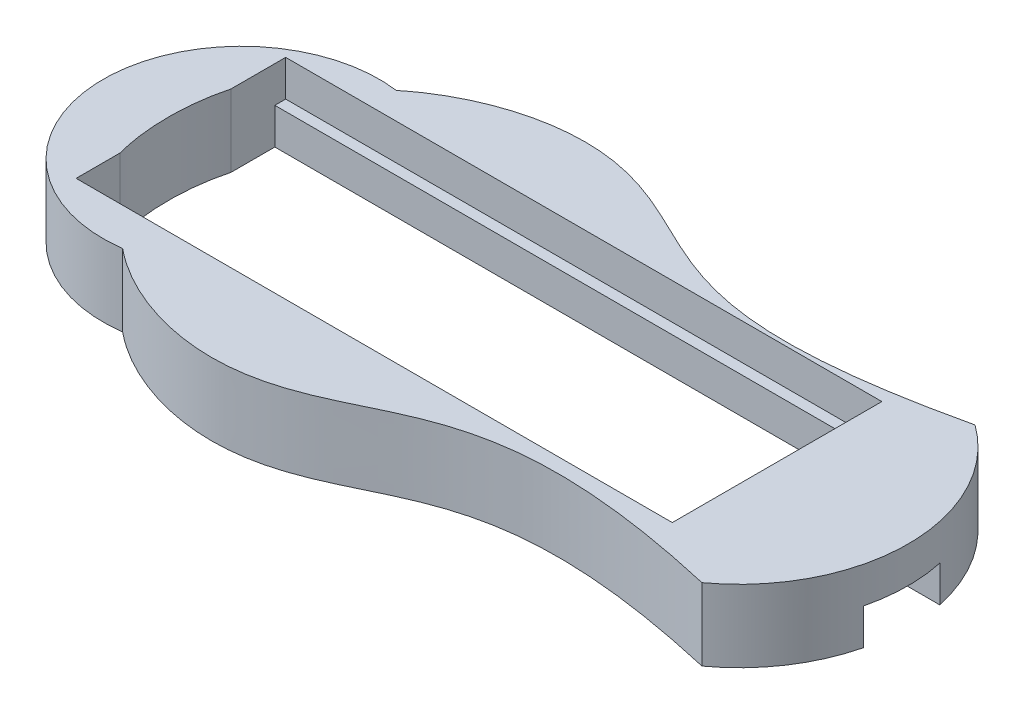
ISO-10303-21;
HEADER;
FILE_DESCRIPTION(('STEP AP214'),'2;1');
FILE_NAME('part.step','',(''),(''),'','','');
FILE_SCHEMA(('AUTOMOTIVE_DESIGN { 1 0 10303 214 1 1 1 1 }'));
ENDSEC;
DATA;
#1=APPLICATION_CONTEXT('core data for automotive mechanical design processes');
#2=APPLICATION_PROTOCOL_DEFINITION('international standard','automotive_design',2000,#1);
#3=PRODUCT_CONTEXT('',#1,'mechanical');
#4=PRODUCT('Part','Part','',(#3));
#5=PRODUCT_RELATED_PRODUCT_CATEGORY('part','',(#4));
#6=PRODUCT_DEFINITION_FORMATION('','',#4);
#7=PRODUCT_DEFINITION_CONTEXT('part definition',#1,'design');
#8=PRODUCT_DEFINITION('design','',#6,#7);
#9=PRODUCT_DEFINITION_SHAPE('','',#8);
#10=(LENGTH_UNIT() NAMED_UNIT(*) SI_UNIT(.MILLI.,.METRE.));
#11=(NAMED_UNIT(*) PLANE_ANGLE_UNIT() SI_UNIT($,.RADIAN.));
#12=(NAMED_UNIT(*) SI_UNIT($,.STERADIAN.) SOLID_ANGLE_UNIT());
#13=UNCERTAINTY_MEASURE_WITH_UNIT(LENGTH_MEASURE(1.E-05),#10,'distance_accuracy_value','');
#14=(GEOMETRIC_REPRESENTATION_CONTEXT(3) GLOBAL_UNCERTAINTY_ASSIGNED_CONTEXT((#13)) GLOBAL_UNIT_ASSIGNED_CONTEXT((#10,
#11,#12)) REPRESENTATION_CONTEXT('',''));
#15=CARTESIAN_POINT('',(0.,0.,0.));
#16=DIRECTION('',(0.,0.,1.));
#17=DIRECTION('',(1.,0.,0.));
#18=AXIS2_PLACEMENT_3D('',#15,#16,#17);
#19=CARTESIAN_POINT('',(-38.2102703595457,20.,0.));
#20=DIRECTION('',(-1.,0.,0.));
#21=DIRECTION('',(0.,0.,1.));
#22=AXIS2_PLACEMENT_3D('',#19,#20,#21);
#23=PLANE('',#22);
#24=DIRECTION('',(0.,0.,-1.));
#25=VECTOR('',#24,1.);
#26=CARTESIAN_POINT('',(-38.2102703595457,0.,0.));
#27=LINE('',#26,#25);
#28=CARTESIAN_POINT('',(-38.2102703595457,0.,-38.3901446940217));
#29=VERTEX_POINT('',#28);
#30=CARTESIAN_POINT('',(-38.2102703595457,0.,-50.5398767109405));
#31=VERTEX_POINT('',#30);
#32=EDGE_CURVE('E250',#29,#31,#27,.T.);
#33=ORIENTED_EDGE('',*,*,#32,.T.);
#34=DIRECTION('',(0.,-1.,0.));
#35=VECTOR('',#34,1.);
#36=CARTESIAN_POINT('',(-38.2102703595457,20.,-50.5398767109405));
#37=LINE('',#36,#35);
#38=CARTESIAN_POINT('',(-38.2102703595457,10.,-50.5398767109405));
#39=VERTEX_POINT('',#38);
#40=EDGE_CURVE('E260',#39,#31,#37,.T.);
#41=ORIENTED_EDGE('',*,*,#40,.F.);
#42=DIRECTION('',(0.,0.,1.));
#43=VECTOR('',#42,1.);
#44=CARTESIAN_POINT('',(-38.2102703595457,10.,-50.5398767109405));
#45=LINE('',#44,#43);
#46=CARTESIAN_POINT('',(-38.2102703595457,10.,-53.5398767109405));
#47=VERTEX_POINT('',#46);
#48=EDGE_CURVE('E216',#47,#39,#45,.T.);
#49=ORIENTED_EDGE('',*,*,#48,.F.);
#50=DIRECTION('',(0.,1.,0.));
#51=VECTOR('',#50,1.);
#52=CARTESIAN_POINT('',(-38.2102703595457,10.,-53.5398767109405));
#53=LINE('',#52,#51);
#54=CARTESIAN_POINT('',(-38.2102703595457,20.,-53.5398767109405));
#55=VERTEX_POINT('',#54);
#56=EDGE_CURVE('E213',#47,#55,#53,.T.);
#57=ORIENTED_EDGE('',*,*,#56,.T.);
#58=DIRECTION('',(0.,0.,-1.));
#59=VECTOR('',#58,1.);
#60=CARTESIAN_POINT('',(-38.2102703595457,20.,0.));
#61=LINE('',#60,#59);
#62=CARTESIAN_POINT('',(-38.2102703595457,20.,-38.3901446940217));
#63=VERTEX_POINT('',#62);
#64=EDGE_CURVE('E149',#63,#55,#61,.T.);
#65=ORIENTED_EDGE('',*,*,#64,.F.);
#66=DIRECTION('',(0.,-1.,0.));
#67=VECTOR('',#66,1.);
#68=CARTESIAN_POINT('',(-38.2102703595457,20.,-38.3901446940217));
#69=LINE('',#68,#67);
#70=EDGE_CURVE('E64',#63,#29,#69,.T.);
#71=ORIENTED_EDGE('',*,*,#70,.T.);
#72=EDGE_LOOP('',(#33,#41,#49,#57,#65,#71));
#73=FACE_BOUND('',#72,.T.);
#74=ADVANCED_FACE('F39',(#73),#23,.F.);
#75=CARTESIAN_POINT('',(0.,20.,-50.5398767109405));
#76=DIRECTION('',(0.,0.,-1.));
#77=DIRECTION('',(-1.,0.,0.));
#78=AXIS2_PLACEMENT_3D('',#75,#76,#77);
#79=PLANE('',#78);
#80=DIRECTION('',(0.,-1.,0.));
#81=VECTOR('',#80,1.);
#82=CARTESIAN_POINT('',(126.789729640454,20.,-50.5398767109405));
#83=LINE('',#82,#81);
#84=CARTESIAN_POINT('',(126.789729640454,10.,-50.5398767109405));
#85=VERTEX_POINT('',#84);
#86=CARTESIAN_POINT('',(126.789729640454,0.,-50.5398767109405));
#87=VERTEX_POINT('',#86);
#88=EDGE_CURVE('E257',#85,#87,#83,.T.);
#89=ORIENTED_EDGE('',*,*,#88,.F.);
#90=DIRECTION('',(1.,0.,0.));
#91=VECTOR('',#90,1.);
#92=CARTESIAN_POINT('',(-38.2102703595457,10.,-50.5398767109405));
#93=LINE('',#92,#91);
#94=EDGE_CURVE('E227',#39,#85,#93,.T.);
#95=ORIENTED_EDGE('',*,*,#94,.F.);
#96=ORIENTED_EDGE('',*,*,#40,.T.);
#97=DIRECTION('',(1.,0.,0.));
#98=VECTOR('',#97,1.);
#99=CARTESIAN_POINT('',(0.,0.,-50.5398767109405));
#100=LINE('',#99,#98);
#101=EDGE_CURVE('E301',#31,#87,#100,.T.);
#102=ORIENTED_EDGE('',*,*,#101,.T.);
#103=EDGE_LOOP('',(#89,#95,#96,#102));
#104=FACE_BOUND('',#103,.T.);
#105=ADVANCED_FACE('F182',(#104),#79,.F.);
#106=CARTESIAN_POINT('',(126.789729640454,20.,0.));
#107=DIRECTION('',(-1.,0.,0.));
#108=DIRECTION('',(0.,0.,1.));
#109=AXIS2_PLACEMENT_3D('',#106,#107,#108);
#110=PLANE('',#109);
#111=DIRECTION('',(0.,-1.,0.));
#112=VECTOR('',#111,1.);
#113=CARTESIAN_POINT('',(126.789729640454,10.,-11.9953206685679));
#114=LINE('',#113,#112);
#115=CARTESIAN_POINT('',(126.789729640454,10.,-11.9953206685679));
#116=VERTEX_POINT('',#115);
#117=CARTESIAN_POINT('',(126.789729640454,0.,-11.9953206685679));
#118=VERTEX_POINT('',#117);
#119=EDGE_CURVE('E333',#116,#118,#114,.T.);
#120=ORIENTED_EDGE('',*,*,#119,.T.);
#121=DIRECTION('',(0.,0.,-1.));
#122=VECTOR('',#121,1.);
#123=CARTESIAN_POINT('',(126.789729640454,0.,0.));
#124=LINE('',#123,#122);
#125=CARTESIAN_POINT('',(126.789729640454,0.,4.46012328905949));
#126=VERTEX_POINT('',#125);
#127=EDGE_CURVE('E279',#126,#118,#124,.T.);
#128=ORIENTED_EDGE('',*,*,#127,.F.);
#129=DIRECTION('',(0.,-1.,0.));
#130=VECTOR('',#129,1.);
#131=CARTESIAN_POINT('',(126.789729640454,20.,4.46012328905949));
#132=LINE('',#131,#130);
#133=CARTESIAN_POINT('',(126.789729640454,20.,4.46012328905949));
#134=VERTEX_POINT('',#133);
#135=EDGE_CURVE('E139',#134,#126,#132,.T.);
#136=ORIENTED_EDGE('',*,*,#135,.F.);
#137=DIRECTION('',(0.,0.,-1.));
#138=VECTOR('',#137,1.);
#139=CARTESIAN_POINT('',(126.789729640454,20.,0.));
#140=LINE('',#139,#138);
#141=CARTESIAN_POINT('',(126.789729640454,20.,-53.5398767109405));
#142=VERTEX_POINT('',#141);
#143=EDGE_CURVE('E156',#134,#142,#140,.T.);
#144=ORIENTED_EDGE('',*,*,#143,.T.);
#145=DIRECTION('',(0.,1.,0.));
#146=VECTOR('',#145,1.);
#147=CARTESIAN_POINT('',(126.789729640454,10.,-53.5398767109405));
#148=LINE('',#147,#146);
#149=CARTESIAN_POINT('',(126.789729640454,10.,-53.5398767109405));
#150=VERTEX_POINT('',#149);
#151=EDGE_CURVE('E220',#150,#142,#148,.T.);
#152=ORIENTED_EDGE('',*,*,#151,.F.);
#153=DIRECTION('',(0.,0.,-1.));
#154=VECTOR('',#153,1.);
#155=CARTESIAN_POINT('',(126.789729640454,10.,-50.5398767109405));
#156=LINE('',#155,#154);
#157=EDGE_CURVE('E312',#85,#150,#156,.T.);
#158=ORIENTED_EDGE('',*,*,#157,.F.);
#159=ORIENTED_EDGE('',*,*,#88,.T.);
#160=CARTESIAN_POINT('',(126.789729640454,0.,-32.8122567966531));
#161=VERTEX_POINT('',#160);
#162=EDGE_CURVE('E303',#161,#87,#124,.T.);
#163=ORIENTED_EDGE('',*,*,#162,.F.);
#164=DIRECTION('',(0.,-1.,0.));
#165=VECTOR('',#164,1.);
#166=CARTESIAN_POINT('',(126.789729640454,10.,-32.8122567966531));
#167=LINE('',#166,#165);
#168=CARTESIAN_POINT('',(126.789729640454,10.,-32.8122567966531));
#169=VERTEX_POINT('',#168);
#170=EDGE_CURVE('E55',#169,#161,#167,.T.);
#171=ORIENTED_EDGE('',*,*,#170,.F.);
#172=DIRECTION('',(0.,0.,-1.));
#173=VECTOR('',#172,1.);
#174=CARTESIAN_POINT('',(126.789729640454,10.,-11.9953206685679));
#175=LINE('',#174,#173);
#176=EDGE_CURVE('E337',#116,#169,#175,.T.);
#177=ORIENTED_EDGE('',*,*,#176,.F.);
#178=EDGE_LOOP('',(#120,#128,#136,#144,#152,#158,#159,#163,#171,#177));
#179=FACE_BOUND('',#178,.T.);
#180=ADVANCED_FACE('F179',(#179),#110,.T.);
#181=CARTESIAN_POINT('',(0.,20.,4.46012328905949));
#182=DIRECTION('',(0.,0.,-1.));
#183=DIRECTION('',(-1.,0.,0.));
#184=AXIS2_PLACEMENT_3D('',#181,#182,#183);
#185=PLANE('',#184);
#186=DIRECTION('',(1.,0.,0.));
#187=VECTOR('',#186,1.);
#188=CARTESIAN_POINT('',(0.,0.,4.46012328905949));
#189=LINE('',#188,#187);
#190=CARTESIAN_POINT('',(-38.2102703595457,0.,4.46012328905949));
#191=VERTEX_POINT('',#190);
#192=EDGE_CURVE('E135',#191,#126,#189,.T.);
#193=ORIENTED_EDGE('',*,*,#192,.F.);
#194=DIRECTION('',(0.,-1.,0.));
#195=VECTOR('',#194,1.);
#196=CARTESIAN_POINT('',(-38.2102703595457,20.,4.46012328905949));
#197=LINE('',#196,#195);
#198=CARTESIAN_POINT('',(-38.2102703595457,20.,4.46012328905949));
#199=VERTEX_POINT('',#198);
#200=EDGE_CURVE('E129',#199,#191,#197,.T.);
#201=ORIENTED_EDGE('',*,*,#200,.F.);
#202=DIRECTION('',(1.,0.,0.));
#203=VECTOR('',#202,1.);
#204=CARTESIAN_POINT('',(0.,20.,4.46012328905949));
#205=LINE('',#204,#203);
#206=EDGE_CURVE('E133',#199,#134,#205,.T.);
#207=ORIENTED_EDGE('',*,*,#206,.T.);
#208=ORIENTED_EDGE('',*,*,#135,.T.);
#209=EDGE_LOOP('',(#193,#201,#207,#208));
#210=FACE_BOUND('',#209,.T.);
#211=ADVANCED_FACE('F131',(#210),#185,.T.);
#212=CARTESIAN_POINT('',(-38.2102703595457,0.,-7.68960872785927));
#213=VERTEX_POINT('',#212);
#214=EDGE_CURVE('E246',#191,#213,#27,.T.);
#215=ORIENTED_EDGE('',*,*,#214,.T.);
#216=DIRECTION('',(0.,-1.,0.));
#217=VECTOR('',#216,1.);
#218=CARTESIAN_POINT('',(-38.2102703595457,20.,-7.68960872785927));
#219=LINE('',#218,#217);
#220=CARTESIAN_POINT('',(-38.2102703595457,20.,-7.68960872785927));
#221=VERTEX_POINT('',#220);
#222=EDGE_CURVE('E140',#221,#213,#219,.T.);
#223=ORIENTED_EDGE('',*,*,#222,.F.);
#224=EDGE_CURVE('E143',#199,#221,#61,.T.);
#225=ORIENTED_EDGE('',*,*,#224,.F.);
#226=ORIENTED_EDGE('',*,*,#200,.T.);
#227=EDGE_LOOP('',(#215,#223,#225,#226));
#228=FACE_BOUND('',#227,.T.);
#229=ADVANCED_FACE('F144',(#228),#23,.F.);
#230=CARTESIAN_POINT('',(145.295936905638,20.,14.7524245262638));
#231=CARTESIAN_POINT('',(44.1561384685699,20.,-8.44462954936845));
#232=CARTESIAN_POINT('',(68.5985438614828,20.,35.3951638853066));
#233=CARTESIAN_POINT('',(14.8613802237304,20.,39.3812531546836));
#234=CARTESIAN_POINT('',(-14.9446777182655,20.,14.8448677957247));
#235=B_SPLINE_CURVE_WITH_KNOTS('',4,(#230,#231,#232,#233,#234),.UNSPECIFIED.,.F.,.F.,(5,5),(0.,
1.),.UNSPECIFIED.);
#236=DIRECTION('',(0.,-1.,0.));
#237=VECTOR('',#236,1.);
#238=SURFACE_OF_LINEAR_EXTRUSION('',#235,#237);
#239=CARTESIAN_POINT('',(145.295936905638,0.,14.7524245262638));
#240=CARTESIAN_POINT('',(44.1561384685699,0.,-8.44462954936845));
#241=CARTESIAN_POINT('',(68.5985438614828,0.,35.3951638853066));
#242=CARTESIAN_POINT('',(14.8613802237304,0.,39.3812531546836));
#243=CARTESIAN_POINT('',(-14.9446777182655,0.,14.8448677957247));
#244=B_SPLINE_CURVE_WITH_KNOTS('',4,(#239,#240,#241,#242,#243),.UNSPECIFIED.,.F.,.F.,(5,5),(0.,
1.),.UNSPECIFIED.);
#245=CARTESIAN_POINT('',(145.295936905638,0.,14.7524245262638));
#246=VERTEX_POINT('',#245);
#247=CARTESIAN_POINT('',(-14.9446777182655,0.,14.8448677957247));
#248=VERTEX_POINT('',#247);
#249=EDGE_CURVE('E163',#246,#248,#244,.T.);
#250=ORIENTED_EDGE('',*,*,#249,.F.);
#251=DIRECTION('',(0.,-1.,0.));
#252=VECTOR('',#251,1.);
#253=CARTESIAN_POINT('',(145.295936905638,20.,14.7524245262638));
#254=LINE('',#253,#252);
#255=CARTESIAN_POINT('',(145.295936905638,20.,14.7524245262638));
#256=VERTEX_POINT('',#255);
#257=EDGE_CURVE('E109',#256,#246,#254,.T.);
#258=ORIENTED_EDGE('',*,*,#257,.F.);
#259=CARTESIAN_POINT('',(-14.9446777182655,20.,14.8448677957247));
#260=VERTEX_POINT('',#259);
#261=EDGE_CURVE('E236',#256,#260,#235,.T.);
#262=ORIENTED_EDGE('',*,*,#261,.T.);
#263=DIRECTION('',(0.,-1.,0.));
#264=VECTOR('',#263,1.);
#265=CARTESIAN_POINT('',(-14.9446777182655,20.,14.8448677957247));
#266=LINE('',#265,#264);
#267=EDGE_CURVE('E162',#260,#248,#266,.T.);
#268=ORIENTED_EDGE('',*,*,#267,.T.);
#269=EDGE_LOOP('',(#250,#258,#262,#268));
#270=FACE_BOUND('',#269,.T.);
#271=ADVANCED_FACE('F41',(#270),#238,.T.);
#272=CARTESIAN_POINT('',(117.880346071745,20.,-23.0398767109405));
#273=DIRECTION('',(0.,-1.,0.));
#274=DIRECTION('',(0.,0.,-1.));
#275=AXIS2_PLACEMENT_3D('',#272,#273,#274);
#276=CYLINDRICAL_SURFACE('',#275,46.6891063694201);
#277=CARTESIAN_POINT('',(117.880346071745,0.,-23.0398767109405));
#278=DIRECTION('',(0.,1.,0.));
#279=DIRECTION('',(0.,0.,1.));
#280=AXIS2_PLACEMENT_3D('',#277,#278,#279);
#281=CIRCLE('',#280,46.6891063694201);
#282=CARTESIAN_POINT('',(163.244323359919,0.,-11.9953206685679));
#283=VERTEX_POINT('',#282);
#284=EDGE_CURVE('E276',#246,#283,#281,.T.);
#285=ORIENTED_EDGE('',*,*,#284,.T.);
#286=DIRECTION('',(0.,-1.,0.));
#287=VECTOR('',#286,1.);
#288=CARTESIAN_POINT('',(163.244323359919,20.,-11.9953206685679));
#289=LINE('',#288,#287);
#290=CARTESIAN_POINT('',(163.244323359919,10.,-11.9953206685679));
#291=VERTEX_POINT('',#290);
#292=EDGE_CURVE('E225',#283,#291,#289,.F.);
#293=ORIENTED_EDGE('',*,*,#292,.T.);
#294=CARTESIAN_POINT('',(117.880346071745,10.,-23.0398767109405));
#295=DIRECTION('',(0.,-1.,0.));
#296=DIRECTION('',(0.,0.,-1.));
#297=AXIS2_PLACEMENT_3D('',#294,#295,#296);
#298=CIRCLE('',#297,46.6891063694201);
#299=CARTESIAN_POINT('',(163.535282727439,10.,-32.8122567966531));
#300=VERTEX_POINT('',#299);
#301=EDGE_CURVE('E11',#300,#291,#298,.T.);
#302=ORIENTED_EDGE('',*,*,#301,.F.);
#303=DIRECTION('',(0.,-1.,0.));
#304=VECTOR('',#303,1.);
#305=CARTESIAN_POINT('',(163.535282727439,20.,-32.8122567966531));
#306=LINE('',#305,#304);
#307=CARTESIAN_POINT('',(163.535282727439,0.,-32.8122567966531));
#308=VERTEX_POINT('',#307);
#309=EDGE_CURVE('E230',#300,#308,#306,.T.);
#310=ORIENTED_EDGE('',*,*,#309,.T.);
#311=CARTESIAN_POINT('',(145.295936905638,0.,-60.8321779481449));
#312=VERTEX_POINT('',#311);
#313=EDGE_CURVE('E290',#308,#312,#281,.T.);
#314=ORIENTED_EDGE('',*,*,#313,.T.);
#315=DIRECTION('',(0.,-1.,0.));
#316=VECTOR('',#315,1.);
#317=CARTESIAN_POINT('',(145.295936905638,20.,-60.8321779481449));
#318=LINE('',#317,#316);
#319=CARTESIAN_POINT('',(145.295936905638,20.,-60.8321779481449));
#320=VERTEX_POINT('',#319);
#321=EDGE_CURVE('E266',#320,#312,#318,.T.);
#322=ORIENTED_EDGE('',*,*,#321,.F.);
#323=CARTESIAN_POINT('',(117.880346071745,20.,-23.0398767109405));
#324=DIRECTION('',(0.,1.,0.));
#325=DIRECTION('',(0.,0.,1.));
#326=AXIS2_PLACEMENT_3D('',#323,#324,#325);
#327=CIRCLE('',#326,46.6891063694201);
#328=EDGE_CURVE('E202',#256,#320,#327,.T.);
#329=ORIENTED_EDGE('',*,*,#328,.F.);
#330=ORIENTED_EDGE('',*,*,#257,.T.);
#331=EDGE_LOOP('',(#285,#293,#302,#310,#314,#322,#329,#330));
#332=FACE_BOUND('',#331,.T.);
#333=ADVANCED_FACE('F193',(#332),#276,.T.);
#334=CARTESIAN_POINT('',(145.295936905638,20.,-60.8321779481449));
#335=CARTESIAN_POINT('',(44.1561384685699,20.,-37.6351238725126));
#336=CARTESIAN_POINT('',(68.5985438614828,20.,-81.4749173071876));
#337=CARTESIAN_POINT('',(14.8613802237304,20.,-85.4610065765647));
#338=CARTESIAN_POINT('',(-14.9446777182655,20.,-60.9246212176057));
#339=B_SPLINE_CURVE_WITH_KNOTS('',4,(#334,#335,#336,#337,#338),.UNSPECIFIED.,.F.,.F.,(5,5),(0.,
1.),.UNSPECIFIED.);
#340=DIRECTION('',(0.,-1.,0.));
#341=VECTOR('',#340,1.);
#342=SURFACE_OF_LINEAR_EXTRUSION('',#339,#341);
#343=CARTESIAN_POINT('',(145.295936905638,0.,-60.8321779481449));
#344=CARTESIAN_POINT('',(44.1561384685699,0.,-37.6351238725126));
#345=CARTESIAN_POINT('',(68.5985438614828,0.,-81.4749173071876));
#346=CARTESIAN_POINT('',(14.8613802237304,0.,-85.4610065765647));
#347=CARTESIAN_POINT('',(-14.9446777182655,0.,-60.9246212176057));
#348=B_SPLINE_CURVE_WITH_KNOTS('',4,(#343,#344,#345,#346,#347),.UNSPECIFIED.,.F.,.F.,(5,5),(0.,
1.),.UNSPECIFIED.);
#349=CARTESIAN_POINT('',(-14.9446777182655,0.,-60.9246212176057));
#350=VERTEX_POINT('',#349);
#351=EDGE_CURVE('E289',#312,#350,#348,.T.);
#352=ORIENTED_EDGE('',*,*,#351,.T.);
#353=DIRECTION('',(0.,-1.,0.));
#354=VECTOR('',#353,1.);
#355=CARTESIAN_POINT('',(-14.9446777182655,20.,-60.9246212176057));
#356=LINE('',#355,#354);
#357=CARTESIAN_POINT('',(-14.9446777182655,20.,-60.9246212176057));
#358=VERTEX_POINT('',#357);
#359=EDGE_CURVE('E263',#358,#350,#356,.T.);
#360=ORIENTED_EDGE('',*,*,#359,.F.);
#361=EDGE_CURVE('E195',#320,#358,#339,.T.);
#362=ORIENTED_EDGE('',*,*,#361,.F.);
#363=ORIENTED_EDGE('',*,*,#321,.T.);
#364=EDGE_LOOP('',(#352,#360,#362,#363));
#365=FACE_BOUND('',#364,.T.);
#366=ADVANCED_FACE('F189',(#365),#342,.F.);
#367=CARTESIAN_POINT('',(-19.9935891967644,20.,-23.0398767109405));
#368=DIRECTION('',(0.,-1.,0.));
#369=DIRECTION('',(0.,0.,-1.));
#370=AXIS2_PLACEMENT_3D('',#367,#368,#369);
#371=CYLINDRICAL_SURFACE('',#370,38.2196987619345);
#372=CARTESIAN_POINT('',(-19.9935891967644,0.,-23.0398767109405));
#373=DIRECTION('',(0.,1.,0.));
#374=DIRECTION('',(0.,0.,1.));
#375=AXIS2_PLACEMENT_3D('',#372,#373,#374);
#376=CIRCLE('',#375,38.2196987619345);
#377=EDGE_CURVE('E291',#350,#248,#376,.T.);
#378=ORIENTED_EDGE('',*,*,#377,.T.);
#379=ORIENTED_EDGE('',*,*,#267,.F.);
#380=CARTESIAN_POINT('',(-19.9935891967644,20.,-23.0398767109405));
#381=DIRECTION('',(0.,1.,0.));
#382=DIRECTION('',(0.,0.,1.));
#383=AXIS2_PLACEMENT_3D('',#380,#381,#382);
#384=CIRCLE('',#383,38.2196987619345);
#385=EDGE_CURVE('E201',#358,#260,#384,.T.);
#386=ORIENTED_EDGE('',*,*,#385,.F.);
#387=ORIENTED_EDGE('',*,*,#359,.T.);
#388=EDGE_LOOP('',(#378,#379,#386,#387));
#389=FACE_BOUND('',#388,.T.);
#390=ADVANCED_FACE('F172',(#389),#371,.T.);
#391=CARTESIAN_POINT('',(-24.8419245459887,20.,-23.0398767109405));
#392=DIRECTION('',(0.,1.,0.));
#393=DIRECTION('',(0.,0.,1.));
#394=AXIS2_PLACEMENT_3D('',#391,#392,#393);
#395=ELLIPSE('',#394,31.5616397660669,15.2998016245788);
#396=DIRECTION('',(0.,-1.,0.));
#397=VECTOR('',#396,1.);
#398=SURFACE_OF_LINEAR_EXTRUSION('',#395,#397);
#399=CARTESIAN_POINT('',(-24.8419245459887,0.,-23.0398767109405));
#400=DIRECTION('',(0.,1.,0.));
#401=DIRECTION('',(0.,0.,1.));
#402=AXIS2_PLACEMENT_3D('',#399,#400,#401);
#403=ELLIPSE('',#402,31.5616397660669,15.2998016245788);
#404=EDGE_CURVE('E240',#29,#213,#403,.T.);
#405=ORIENTED_EDGE('',*,*,#404,.F.);
#406=ORIENTED_EDGE('',*,*,#70,.F.);
#407=EDGE_CURVE('E147',#63,#221,#395,.T.);
#408=ORIENTED_EDGE('',*,*,#407,.T.);
#409=ORIENTED_EDGE('',*,*,#222,.T.);
#410=EDGE_LOOP('',(#405,#406,#408,#409));
#411=FACE_BOUND('',#410,.T.);
#412=ADVANCED_FACE('F168',(#411),#398,.T.);
#413=CARTESIAN_POINT('',(0.,20.,0.));
#414=DIRECTION('',(0.,1.,0.));
#415=DIRECTION('',(0.,0.,1.));
#416=AXIS2_PLACEMENT_3D('',#413,#414,#415);
#417=PLANE('',#416);
#418=ORIENTED_EDGE('',*,*,#64,.T.);
#419=DIRECTION('',(-1.,0.,0.));
#420=VECTOR('',#419,1.);
#421=CARTESIAN_POINT('',(-38.2102703595457,20.,-53.5398767109405));
#422=LINE('',#421,#420);
#423=EDGE_CURVE('E209',#142,#55,#422,.T.);
#424=ORIENTED_EDGE('',*,*,#423,.F.);
#425=ORIENTED_EDGE('',*,*,#143,.F.);
#426=ORIENTED_EDGE('',*,*,#206,.F.);
#427=ORIENTED_EDGE('',*,*,#224,.T.);
#428=ORIENTED_EDGE('',*,*,#407,.F.);
#429=EDGE_LOOP('',(#418,#424,#425,#426,#427,#428));
#430=FACE_BOUND('',#429,.T.);
#431=ORIENTED_EDGE('',*,*,#261,.F.);
#432=ORIENTED_EDGE('',*,*,#328,.T.);
#433=ORIENTED_EDGE('',*,*,#361,.T.);
#434=ORIENTED_EDGE('',*,*,#385,.T.);
#435=EDGE_LOOP('',(#431,#432,#433,#434));
#436=FACE_BOUND('',#435,.T.);
#437=ADVANCED_FACE('F152',(#430,#436),#417,.T.);
#438=CARTESIAN_POINT('',(0.,0.,0.));
#439=DIRECTION('',(0.,1.,0.));
#440=DIRECTION('',(0.,0.,1.));
#441=AXIS2_PLACEMENT_3D('',#438,#439,#440);
#442=PLANE('',#441);
#443=ORIENTED_EDGE('',*,*,#127,.T.);
#444=DIRECTION('',(1.,0.,0.));
#445=VECTOR('',#444,1.);
#446=CARTESIAN_POINT('',(0.,0.,-11.9953206685679));
#447=LINE('',#446,#445);
#448=EDGE_CURVE('E48',#118,#283,#447,.T.);
#449=ORIENTED_EDGE('',*,*,#448,.T.);
#450=ORIENTED_EDGE('',*,*,#284,.F.);
#451=ORIENTED_EDGE('',*,*,#249,.T.);
#452=ORIENTED_EDGE('',*,*,#377,.F.);
#453=ORIENTED_EDGE('',*,*,#351,.F.);
#454=ORIENTED_EDGE('',*,*,#313,.F.);
#455=DIRECTION('',(1.,0.,0.));
#456=VECTOR('',#455,1.);
#457=CARTESIAN_POINT('',(126.789729640454,0.,-32.8122567966531));
#458=LINE('',#457,#456);
#459=EDGE_CURVE('E307',#161,#308,#458,.T.);
#460=ORIENTED_EDGE('',*,*,#459,.F.);
#461=ORIENTED_EDGE('',*,*,#162,.T.);
#462=ORIENTED_EDGE('',*,*,#101,.F.);
#463=ORIENTED_EDGE('',*,*,#32,.F.);
#464=ORIENTED_EDGE('',*,*,#404,.T.);
#465=ORIENTED_EDGE('',*,*,#214,.F.);
#466=ORIENTED_EDGE('',*,*,#192,.T.);
#467=EDGE_LOOP('',(#443,#449,#450,#451,#452,#453,#454,#460,#461,#462,#463,#464,#465,#466));
#468=FACE_BOUND('',#467,.T.);
#469=ADVANCED_FACE('F173',(#468),#442,.F.);
#470=CARTESIAN_POINT('',(-38.2102703595457,10.,-53.5398767109405));
#471=DIRECTION('',(0.,0.,-1.));
#472=DIRECTION('',(-1.,0.,0.));
#473=AXIS2_PLACEMENT_3D('',#470,#471,#472);
#474=PLANE('',#473);
#475=ORIENTED_EDGE('',*,*,#423,.T.);
#476=ORIENTED_EDGE('',*,*,#56,.F.);
#477=DIRECTION('',(-1.,0.,0.));
#478=VECTOR('',#477,1.);
#479=CARTESIAN_POINT('',(-38.2102703595457,10.,-53.5398767109405));
#480=LINE('',#479,#478);
#481=EDGE_CURVE('E233',#150,#47,#480,.T.);
#482=ORIENTED_EDGE('',*,*,#481,.F.);
#483=ORIENTED_EDGE('',*,*,#151,.T.);
#484=EDGE_LOOP('',(#475,#476,#482,#483));
#485=FACE_BOUND('',#484,.T.);
#486=ADVANCED_FACE('F223',(#485),#474,.F.);
#487=CARTESIAN_POINT('',(0.,10.,0.));
#488=DIRECTION('',(0.,-1.,0.));
#489=DIRECTION('',(0.,0.,-1.));
#490=AXIS2_PLACEMENT_3D('',#487,#488,#489);
#491=PLANE('',#490);
#492=ORIENTED_EDGE('',*,*,#48,.T.);
#493=ORIENTED_EDGE('',*,*,#94,.T.);
#494=ORIENTED_EDGE('',*,*,#157,.T.);
#495=ORIENTED_EDGE('',*,*,#481,.T.);
#496=EDGE_LOOP('',(#492,#493,#494,#495));
#497=FACE_BOUND('',#496,.T.);
#498=ADVANCED_FACE('F344',(#497),#491,.F.);
#499=CARTESIAN_POINT('',(0.,10.,0.));
#500=DIRECTION('',(0.,-1.,0.));
#501=DIRECTION('',(0.,0.,-1.));
#502=AXIS2_PLACEMENT_3D('',#499,#500,#501);
#503=PLANE('',#502);
#504=ORIENTED_EDGE('',*,*,#301,.T.);
#505=DIRECTION('',(-1.,0.,0.));
#506=VECTOR('',#505,1.);
#507=CARTESIAN_POINT('',(126.789729640454,10.,-11.9953206685679));
#508=LINE('',#507,#506);
#509=EDGE_CURVE('E329',#291,#116,#508,.T.);
#510=ORIENTED_EDGE('',*,*,#509,.T.);
#511=ORIENTED_EDGE('',*,*,#176,.T.);
#512=DIRECTION('',(1.,0.,0.));
#513=VECTOR('',#512,1.);
#514=CARTESIAN_POINT('',(126.789729640454,10.,-32.8122567966531));
#515=LINE('',#514,#513);
#516=EDGE_CURVE('E330',#169,#300,#515,.T.);
#517=ORIENTED_EDGE('',*,*,#516,.T.);
#518=EDGE_LOOP('',(#504,#510,#511,#517));
#519=FACE_BOUND('',#518,.T.);
#520=ADVANCED_FACE('F326',(#519),#503,.T.);
#521=CARTESIAN_POINT('',(126.789729640454,10.,-11.9953206685679));
#522=DIRECTION('',(0.,0.,1.));
#523=DIRECTION('',(1.,0.,0.));
#524=AXIS2_PLACEMENT_3D('',#521,#522,#523);
#525=PLANE('',#524);
#526=ORIENTED_EDGE('',*,*,#448,.F.);
#527=ORIENTED_EDGE('',*,*,#119,.F.);
#528=ORIENTED_EDGE('',*,*,#509,.F.);
#529=ORIENTED_EDGE('',*,*,#292,.F.);
#530=EDGE_LOOP('',(#526,#527,#528,#529));
#531=FACE_BOUND('',#530,.T.);
#532=ADVANCED_FACE('F332',(#531),#525,.F.);
#533=CARTESIAN_POINT('',(126.789729640454,10.,-32.8122567966531));
#534=DIRECTION('',(0.,0.,-1.));
#535=DIRECTION('',(-1.,0.,0.));
#536=AXIS2_PLACEMENT_3D('',#533,#534,#535);
#537=PLANE('',#536);
#538=ORIENTED_EDGE('',*,*,#516,.F.);
#539=ORIENTED_EDGE('',*,*,#170,.T.);
#540=ORIENTED_EDGE('',*,*,#459,.T.);
#541=ORIENTED_EDGE('',*,*,#309,.F.);
#542=EDGE_LOOP('',(#538,#539,#540,#541));
#543=FACE_BOUND('',#542,.T.);
#544=ADVANCED_FACE('F403',(#543),#537,.F.);
#545=CLOSED_SHELL('',(#74,#105,#180,#211,#229,#271,#333,#366,#390,#412,#437,#469,#486,#498,#520,
#532,#544));
#546=MANIFOLD_SOLID_BREP('B2',#545);
#547=ADVANCED_BREP_SHAPE_REPRESENTATION('',(#18,#546),#14);
#548=SHAPE_DEFINITION_REPRESENTATION(#9,#547);
ENDSEC;
END-ISO-10303-21;
